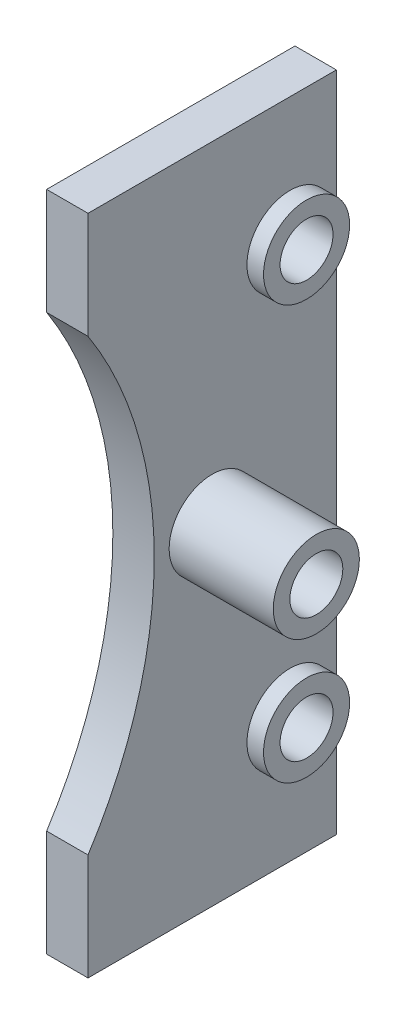
ISO-10303-21;
HEADER;
FILE_DESCRIPTION(('STEP AP214'),'2;1');
FILE_NAME('part.step','',(''),(''),'','','');
FILE_SCHEMA(('AUTOMOTIVE_DESIGN { 1 0 10303 214 1 1 1 1 }'));
ENDSEC;
DATA;
#1=APPLICATION_CONTEXT('core data for automotive mechanical design processes');
#2=APPLICATION_PROTOCOL_DEFINITION('international standard','automotive_design',2000,#1);
#3=PRODUCT_CONTEXT('',#1,'mechanical');
#4=PRODUCT('Part','Part','',(#3));
#5=PRODUCT_RELATED_PRODUCT_CATEGORY('part','',(#4));
#6=PRODUCT_DEFINITION_FORMATION('','',#4);
#7=PRODUCT_DEFINITION_CONTEXT('part definition',#1,'design');
#8=PRODUCT_DEFINITION('design','',#6,#7);
#9=PRODUCT_DEFINITION_SHAPE('','',#8);
#10=(LENGTH_UNIT() NAMED_UNIT(*) SI_UNIT(.MILLI.,.METRE.));
#11=(NAMED_UNIT(*) PLANE_ANGLE_UNIT() SI_UNIT($,.RADIAN.));
#12=(NAMED_UNIT(*) SI_UNIT($,.STERADIAN.) SOLID_ANGLE_UNIT());
#13=UNCERTAINTY_MEASURE_WITH_UNIT(LENGTH_MEASURE(1.E-05),#10,'distance_accuracy_value','');
#14=(GEOMETRIC_REPRESENTATION_CONTEXT(3) GLOBAL_UNCERTAINTY_ASSIGNED_CONTEXT((#13)) GLOBAL_UNIT_ASSIGNED_CONTEXT((#10,
#11,#12)) REPRESENTATION_CONTEXT('',''));
#15=CARTESIAN_POINT('',(0.,0.,0.));
#16=DIRECTION('',(0.,0.,1.));
#17=DIRECTION('',(1.,0.,0.));
#18=AXIS2_PLACEMENT_3D('',#15,#16,#17);
#19=CARTESIAN_POINT('',(-7.5,0.,0.));
#20=DIRECTION('',(0.,0.,1.));
#21=DIRECTION('',(-1.,0.,0.));
#22=AXIS2_PLACEMENT_3D('',#19,#20,#21);
#23=PLANE('',#22);
#24=DIRECTION('',(-1.,0.,0.));
#25=VECTOR('',#24,1.);
#26=CARTESIAN_POINT('',(-2.5,33.5646599662505,0.));
#27=LINE('',#26,#25);
#28=CARTESIAN_POINT('',(-2.5,33.5646599662505,0.));
#29=VERTEX_POINT('',#28);
#30=CARTESIAN_POINT('',(-5.,33.5646599662505,0.));
#31=VERTEX_POINT('',#30);
#32=EDGE_CURVE('E84',#29,#31,#27,.T.);
#33=ORIENTED_EDGE('',*,*,#32,.F.);
#34=DIRECTION('',(0.,1.,0.));
#35=VECTOR('',#34,1.);
#36=CARTESIAN_POINT('',(-2.5,0.,0.));
#37=LINE('',#36,#35);
#38=CARTESIAN_POINT('',(-2.5,40.,0.));
#39=VERTEX_POINT('',#38);
#40=EDGE_CURVE('E134',#29,#39,#37,.T.);
#41=ORIENTED_EDGE('',*,*,#40,.T.);
#42=DIRECTION('',(1.,0.,0.));
#43=VECTOR('',#42,1.);
#44=CARTESIAN_POINT('',(-7.5,40.,0.));
#45=LINE('',#44,#43);
#46=CARTESIAN_POINT('',(-5.,40.,0.));
#47=VERTEX_POINT('',#46);
#48=EDGE_CURVE('E160',#47,#39,#45,.T.);
#49=ORIENTED_EDGE('',*,*,#48,.F.);
#50=DIRECTION('',(0.,1.,0.));
#51=VECTOR('',#50,1.);
#52=CARTESIAN_POINT('',(-5.,0.,0.));
#53=LINE('',#52,#51);
#54=EDGE_CURVE('E136',#31,#47,#53,.T.);
#55=ORIENTED_EDGE('',*,*,#54,.F.);
#56=EDGE_LOOP('',(#33,#41,#49,#55));
#57=FACE_BOUND('',#56,.T.);
#58=ADVANCED_FACE('F68',(#57),#23,.T.);
#59=CARTESIAN_POINT('',(-7.5,0.,0.));
#60=DIRECTION('',(0.,1.,0.));
#61=DIRECTION('',(0.,0.,1.));
#62=AXIS2_PLACEMENT_3D('',#59,#60,#61);
#63=PLANE('',#62);
#64=DIRECTION('',(0.,0.,1.));
#65=VECTOR('',#64,1.);
#66=CARTESIAN_POINT('',(-5.,0.,0.));
#67=LINE('',#66,#65);
#68=CARTESIAN_POINT('',(-5.,0.,-15.));
#69=VERTEX_POINT('',#68);
#70=CARTESIAN_POINT('',(-5.,0.,0.));
#71=VERTEX_POINT('',#70);
#72=EDGE_CURVE('E92',#69,#71,#67,.T.);
#73=ORIENTED_EDGE('',*,*,#72,.F.);
#74=DIRECTION('',(1.,0.,0.));
#75=VECTOR('',#74,1.);
#76=CARTESIAN_POINT('',(-7.5,0.,-15.));
#77=LINE('',#76,#75);
#78=CARTESIAN_POINT('',(-2.5,0.,-15.));
#79=VERTEX_POINT('',#78);
#80=EDGE_CURVE('E164',#69,#79,#77,.T.);
#81=ORIENTED_EDGE('',*,*,#80,.T.);
#82=DIRECTION('',(0.,0.,-1.));
#83=VECTOR('',#82,1.);
#84=CARTESIAN_POINT('',(-2.5,0.,0.));
#85=LINE('',#84,#83);
#86=CARTESIAN_POINT('',(-2.5,0.,0.));
#87=VERTEX_POINT('',#86);
#88=EDGE_CURVE('E147',#87,#79,#85,.T.);
#89=ORIENTED_EDGE('',*,*,#88,.F.);
#90=DIRECTION('',(1.,0.,0.));
#91=VECTOR('',#90,1.);
#92=CARTESIAN_POINT('',(-7.5,0.,0.));
#93=LINE('',#92,#91);
#94=EDGE_CURVE('E158',#71,#87,#93,.T.);
#95=ORIENTED_EDGE('',*,*,#94,.F.);
#96=EDGE_LOOP('',(#73,#81,#89,#95));
#97=FACE_BOUND('',#96,.T.);
#98=ADVANCED_FACE('F70',(#97),#63,.F.);
#99=CARTESIAN_POINT('',(-7.5,0.,-15.));
#100=DIRECTION('',(0.,0.,1.));
#101=DIRECTION('',(-1.,0.,0.));
#102=AXIS2_PLACEMENT_3D('',#99,#100,#101);
#103=PLANE('',#102);
#104=DIRECTION('',(0.,-1.,0.));
#105=VECTOR('',#104,1.);
#106=CARTESIAN_POINT('',(-5.,0.,-15.));
#107=LINE('',#106,#105);
#108=CARTESIAN_POINT('',(-5.,40.,-15.));
#109=VERTEX_POINT('',#108);
#110=EDGE_CURVE('E221',#109,#69,#107,.T.);
#111=ORIENTED_EDGE('',*,*,#110,.F.);
#112=DIRECTION('',(1.,0.,0.));
#113=VECTOR('',#112,1.);
#114=CARTESIAN_POINT('',(-7.5,40.,-15.));
#115=LINE('',#114,#113);
#116=CARTESIAN_POINT('',(-2.5,40.,-15.));
#117=VERTEX_POINT('',#116);
#118=EDGE_CURVE('E162',#109,#117,#115,.T.);
#119=ORIENTED_EDGE('',*,*,#118,.T.);
#120=DIRECTION('',(0.,1.,0.));
#121=VECTOR('',#120,1.);
#122=CARTESIAN_POINT('',(-2.5,0.,-15.));
#123=LINE('',#122,#121);
#124=EDGE_CURVE('E155',#79,#117,#123,.T.);
#125=ORIENTED_EDGE('',*,*,#124,.F.);
#126=ORIENTED_EDGE('',*,*,#80,.F.);
#127=EDGE_LOOP('',(#111,#119,#125,#126));
#128=FACE_BOUND('',#127,.T.);
#129=ADVANCED_FACE('F199',(#128),#103,.F.);
#130=CARTESIAN_POINT('',(-7.5,40.,0.));
#131=DIRECTION('',(0.,1.,0.));
#132=DIRECTION('',(0.,0.,1.));
#133=AXIS2_PLACEMENT_3D('',#130,#131,#132);
#134=PLANE('',#133);
#135=ORIENTED_EDGE('',*,*,#118,.F.);
#136=DIRECTION('',(0.,0.,-1.));
#137=VECTOR('',#136,1.);
#138=CARTESIAN_POINT('',(-5.,40.,0.));
#139=LINE('',#138,#137);
#140=EDGE_CURVE('E219',#47,#109,#139,.T.);
#141=ORIENTED_EDGE('',*,*,#140,.F.);
#142=ORIENTED_EDGE('',*,*,#48,.T.);
#143=DIRECTION('',(0.,0.,-1.));
#144=VECTOR('',#143,1.);
#145=CARTESIAN_POINT('',(-2.5,40.,0.));
#146=LINE('',#145,#144);
#147=EDGE_CURVE('E143',#39,#117,#146,.T.);
#148=ORIENTED_EDGE('',*,*,#147,.T.);
#149=EDGE_LOOP('',(#135,#141,#142,#148));
#150=FACE_BOUND('',#149,.T.);
#151=ADVANCED_FACE('F275',(#150),#134,.T.);
#152=CARTESIAN_POINT('',(-7.5,32.5,-12.2));
#153=DIRECTION('',(1.,0.,0.));
#154=DIRECTION('',(0.,0.,1.));
#155=AXIS2_PLACEMENT_3D('',#152,#153,#154);
#156=CYLINDRICAL_SURFACE('',#155,1.6);
#157=CARTESIAN_POINT('',(-1.5,32.5,-12.2));
#158=DIRECTION('',(-1.,0.,0.));
#159=DIRECTION('',(0.,0.,1.));
#160=AXIS2_PLACEMENT_3D('',#157,#158,#159);
#161=CIRCLE('',#160,1.6);
#162=CARTESIAN_POINT('',(-1.5,32.5,-10.6));
#163=VERTEX_POINT('',#162);
#164=EDGE_CURVE('E238',#163,#163,#161,.T.);
#165=ORIENTED_EDGE('',*,*,#164,.F.);
#166=EDGE_LOOP('',(#165));
#167=FACE_BOUND('',#166,.T.);
#168=CARTESIAN_POINT('',(-5.,32.5,-12.2));
#169=DIRECTION('',(-1.,0.,0.));
#170=DIRECTION('',(0.,0.,1.));
#171=AXIS2_PLACEMENT_3D('',#168,#169,#170);
#172=CIRCLE('',#171,1.6);
#173=CARTESIAN_POINT('',(-5.,32.5,-10.6));
#174=VERTEX_POINT('',#173);
#175=EDGE_CURVE('E229',#174,#174,#172,.T.);
#176=ORIENTED_EDGE('',*,*,#175,.T.);
#177=EDGE_LOOP('',(#176));
#178=FACE_BOUND('',#177,.T.);
#179=ADVANCED_FACE('F212',(#167,#178),#156,.F.);
#180=CARTESIAN_POINT('',(-7.5,20.,-7.5));
#181=DIRECTION('',(1.,0.,0.));
#182=DIRECTION('',(0.,0.,1.));
#183=AXIS2_PLACEMENT_3D('',#180,#181,#182);
#184=CYLINDRICAL_SURFACE('',#183,1.6);
#185=CARTESIAN_POINT('',(3.79,20.,-7.5));
#186=DIRECTION('',(1.,0.,0.));
#187=DIRECTION('',(0.,0.,-1.));
#188=AXIS2_PLACEMENT_3D('',#185,#186,#187);
#189=CIRCLE('',#188,1.6);
#190=CARTESIAN_POINT('',(3.79,20.,-9.1));
#191=VERTEX_POINT('',#190);
#192=EDGE_CURVE('E232',#191,#191,#189,.T.);
#193=ORIENTED_EDGE('',*,*,#192,.T.);
#194=EDGE_LOOP('',(#193));
#195=FACE_BOUND('',#194,.T.);
#196=CARTESIAN_POINT('',(-5.,20.,-7.5));
#197=DIRECTION('',(-1.,0.,0.));
#198=DIRECTION('',(0.,0.,1.));
#199=AXIS2_PLACEMENT_3D('',#196,#197,#198);
#200=CIRCLE('',#199,1.6);
#201=CARTESIAN_POINT('',(-5.,20.,-5.9));
#202=VERTEX_POINT('',#201);
#203=EDGE_CURVE('E226',#202,#202,#200,.T.);
#204=ORIENTED_EDGE('',*,*,#203,.T.);
#205=EDGE_LOOP('',(#204));
#206=FACE_BOUND('',#205,.T.);
#207=ADVANCED_FACE('F204',(#195,#206),#184,.F.);
#208=DIRECTION('',(-1.,0.,0.));
#209=VECTOR('',#208,1.);
#210=CARTESIAN_POINT('',(-2.5,6.43534003374946,0.));
#211=LINE('',#210,#209);
#212=CARTESIAN_POINT('',(-2.5,6.43534003374946,0.));
#213=VERTEX_POINT('',#212);
#214=CARTESIAN_POINT('',(-5.,6.43534003374946,0.));
#215=VERTEX_POINT('',#214);
#216=EDGE_CURVE('E124',#213,#215,#211,.T.);
#217=ORIENTED_EDGE('',*,*,#216,.T.);
#218=EDGE_CURVE('E214',#71,#215,#53,.T.);
#219=ORIENTED_EDGE('',*,*,#218,.F.);
#220=ORIENTED_EDGE('',*,*,#94,.T.);
#221=EDGE_CURVE('E144',#87,#213,#37,.T.);
#222=ORIENTED_EDGE('',*,*,#221,.T.);
#223=EDGE_LOOP('',(#217,#219,#220,#222));
#224=FACE_BOUND('',#223,.T.);
#225=ADVANCED_FACE('F193',(#224),#23,.T.);
#226=CARTESIAN_POINT('',(-7.5,7.5,-12.2));
#227=DIRECTION('',(1.,0.,0.));
#228=DIRECTION('',(0.,0.,1.));
#229=AXIS2_PLACEMENT_3D('',#226,#227,#228);
#230=CYLINDRICAL_SURFACE('',#229,1.6);
#231=CARTESIAN_POINT('',(-1.5,7.5,-12.2));
#232=DIRECTION('',(-1.,0.,0.));
#233=DIRECTION('',(0.,0.,1.));
#234=AXIS2_PLACEMENT_3D('',#231,#232,#233);
#235=CIRCLE('',#234,1.6);
#236=CARTESIAN_POINT('',(-1.5,7.5,-10.6));
#237=VERTEX_POINT('',#236);
#238=EDGE_CURVE('E149',#237,#237,#235,.T.);
#239=ORIENTED_EDGE('',*,*,#238,.F.);
#240=EDGE_LOOP('',(#239));
#241=FACE_BOUND('',#240,.T.);
#242=CARTESIAN_POINT('',(-5.,7.5,-12.2));
#243=DIRECTION('',(-1.,0.,0.));
#244=DIRECTION('',(0.,0.,1.));
#245=AXIS2_PLACEMENT_3D('',#242,#243,#244);
#246=CIRCLE('',#245,1.6);
#247=CARTESIAN_POINT('',(-5.,7.5,-10.6));
#248=VERTEX_POINT('',#247);
#249=EDGE_CURVE('E72',#248,#248,#246,.T.);
#250=ORIENTED_EDGE('',*,*,#249,.T.);
#251=EDGE_LOOP('',(#250));
#252=FACE_BOUND('',#251,.T.);
#253=ADVANCED_FACE('F203',(#241,#252),#230,.F.);
#254=CARTESIAN_POINT('',(-2.5,0.,0.));
#255=DIRECTION('',(-1.,0.,0.));
#256=DIRECTION('',(0.,0.,-1.));
#257=AXIS2_PLACEMENT_3D('',#254,#255,#256);
#258=PLANE('',#257);
#259=CARTESIAN_POINT('',(-2.5,32.5,-12.2));
#260=DIRECTION('',(1.,0.,0.));
#261=DIRECTION('',(0.,0.,-1.));
#262=AXIS2_PLACEMENT_3D('',#259,#260,#261);
#263=CIRCLE('',#262,2.6);
#264=CARTESIAN_POINT('',(-2.5,32.5,-14.8));
#265=VERTEX_POINT('',#264);
#266=EDGE_CURVE('E77',#265,#265,#263,.F.);
#267=ORIENTED_EDGE('',*,*,#266,.T.);
#268=EDGE_LOOP('',(#267));
#269=FACE_BOUND('',#268,.T.);
#270=ORIENTED_EDGE('',*,*,#40,.F.);
#271=CARTESIAN_POINT('',(-2.5,20.,21.));
#272=DIRECTION('',(-1.,0.,0.));
#273=DIRECTION('',(0.,0.,1.));
#274=AXIS2_PLACEMENT_3D('',#271,#272,#273);
#275=CIRCLE('',#274,25.);
#276=EDGE_CURVE('E121',#29,#213,#275,.T.);
#277=ORIENTED_EDGE('',*,*,#276,.T.);
#278=ORIENTED_EDGE('',*,*,#221,.F.);
#279=ORIENTED_EDGE('',*,*,#88,.T.);
#280=ORIENTED_EDGE('',*,*,#124,.T.);
#281=ORIENTED_EDGE('',*,*,#147,.F.);
#282=EDGE_LOOP('',(#270,#277,#278,#279,#280,#281));
#283=FACE_BOUND('',#282,.T.);
#284=CARTESIAN_POINT('',(-2.5,7.5,-12.2));
#285=DIRECTION('',(1.,0.,0.));
#286=DIRECTION('',(0.,0.,-1.));
#287=AXIS2_PLACEMENT_3D('',#284,#285,#286);
#288=CIRCLE('',#287,2.6);
#289=CARTESIAN_POINT('',(-2.5,7.5,-14.8));
#290=VERTEX_POINT('',#289);
#291=EDGE_CURVE('E166',#290,#290,#288,.F.);
#292=ORIENTED_EDGE('',*,*,#291,.T.);
#293=EDGE_LOOP('',(#292));
#294=FACE_BOUND('',#293,.T.);
#295=CARTESIAN_POINT('',(-2.5,20.,-7.5));
#296=DIRECTION('',(-1.,0.,0.));
#297=DIRECTION('',(0.,0.,1.));
#298=AXIS2_PLACEMENT_3D('',#295,#296,#297);
#299=CIRCLE('',#298,2.6);
#300=CARTESIAN_POINT('',(-2.5,20.,-4.9));
#301=VERTEX_POINT('',#300);
#302=EDGE_CURVE('E12',#301,#301,#299,.F.);
#303=ORIENTED_EDGE('',*,*,#302,.F.);
#304=EDGE_LOOP('',(#303));
#305=FACE_BOUND('',#304,.T.);
#306=ADVANCED_FACE('F139',(#269,#283,#294,#305),#258,.F.);
#307=CARTESIAN_POINT('',(-1.5,7.5,-12.2));
#308=DIRECTION('',(1.,0.,0.));
#309=DIRECTION('',(0.,0.,1.));
#310=AXIS2_PLACEMENT_3D('',#307,#308,#309);
#311=PLANE('',#310);
#312=CARTESIAN_POINT('',(-1.5,7.5,-12.2));
#313=DIRECTION('',(-1.,0.,0.));
#314=DIRECTION('',(0.,0.,1.));
#315=AXIS2_PLACEMENT_3D('',#312,#313,#314);
#316=CIRCLE('',#315,2.6);
#317=CARTESIAN_POINT('',(-1.5,7.5,-9.6));
#318=VERTEX_POINT('',#317);
#319=EDGE_CURVE('E145',#318,#318,#316,.T.);
#320=ORIENTED_EDGE('',*,*,#319,.F.);
#321=EDGE_LOOP('',(#320));
#322=FACE_BOUND('',#321,.T.);
#323=ORIENTED_EDGE('',*,*,#238,.T.);
#324=EDGE_LOOP('',(#323));
#325=FACE_BOUND('',#324,.T.);
#326=ADVANCED_FACE('F245',(#322,#325),#311,.T.);
#327=CARTESIAN_POINT('',(-1.5,7.5,-12.2));
#328=DIRECTION('',(-1.,0.,0.));
#329=DIRECTION('',(0.,0.,-1.));
#330=AXIS2_PLACEMENT_3D('',#327,#328,#329);
#331=CYLINDRICAL_SURFACE('',#330,2.6);
#332=ORIENTED_EDGE('',*,*,#319,.T.);
#333=EDGE_LOOP('',(#332));
#334=FACE_BOUND('',#333,.T.);
#335=ORIENTED_EDGE('',*,*,#291,.F.);
#336=EDGE_LOOP('',(#335));
#337=FACE_BOUND('',#336,.T.);
#338=ADVANCED_FACE('F186',(#334,#337),#331,.T.);
#339=CARTESIAN_POINT('',(-1.5,32.5,-12.2));
#340=DIRECTION('',(1.,0.,0.));
#341=DIRECTION('',(0.,0.,1.));
#342=AXIS2_PLACEMENT_3D('',#339,#340,#341);
#343=PLANE('',#342);
#344=CARTESIAN_POINT('',(-1.5,32.5,-12.2));
#345=DIRECTION('',(-1.,0.,0.));
#346=DIRECTION('',(0.,0.,1.));
#347=AXIS2_PLACEMENT_3D('',#344,#345,#346);
#348=CIRCLE('',#347,2.6);
#349=CARTESIAN_POINT('',(-1.5,32.5,-9.60000000000001));
#350=VERTEX_POINT('',#349);
#351=EDGE_CURVE('E241',#350,#350,#348,.T.);
#352=ORIENTED_EDGE('',*,*,#351,.F.);
#353=EDGE_LOOP('',(#352));
#354=FACE_BOUND('',#353,.T.);
#355=ORIENTED_EDGE('',*,*,#164,.T.);
#356=EDGE_LOOP('',(#355));
#357=FACE_BOUND('',#356,.T.);
#358=ADVANCED_FACE('F176',(#354,#357),#343,.T.);
#359=CARTESIAN_POINT('',(-1.5,32.5,-12.2));
#360=DIRECTION('',(-1.,0.,0.));
#361=DIRECTION('',(0.,0.,-1.));
#362=AXIS2_PLACEMENT_3D('',#359,#360,#361);
#363=CYLINDRICAL_SURFACE('',#362,2.6);
#364=ORIENTED_EDGE('',*,*,#351,.T.);
#365=EDGE_LOOP('',(#364));
#366=FACE_BOUND('',#365,.T.);
#367=ORIENTED_EDGE('',*,*,#266,.F.);
#368=EDGE_LOOP('',(#367));
#369=FACE_BOUND('',#368,.T.);
#370=ADVANCED_FACE('F173',(#366,#369),#363,.T.);
#371=CARTESIAN_POINT('',(3.79,20.,-7.5));
#372=DIRECTION('',(1.,0.,0.));
#373=DIRECTION('',(0.,0.,-1.));
#374=AXIS2_PLACEMENT_3D('',#371,#372,#373);
#375=PLANE('',#374);
#376=CARTESIAN_POINT('',(3.79,20.,-7.5));
#377=DIRECTION('',(1.,0.,0.));
#378=DIRECTION('',(0.,0.,-1.));
#379=AXIS2_PLACEMENT_3D('',#376,#377,#378);
#380=CIRCLE('',#379,2.6);
#381=CARTESIAN_POINT('',(3.79,20.,-10.1));
#382=VERTEX_POINT('',#381);
#383=EDGE_CURVE('E235',#382,#382,#380,.T.);
#384=ORIENTED_EDGE('',*,*,#383,.T.);
#385=EDGE_LOOP('',(#384));
#386=FACE_BOUND('',#385,.T.);
#387=ORIENTED_EDGE('',*,*,#192,.F.);
#388=EDGE_LOOP('',(#387));
#389=FACE_BOUND('',#388,.T.);
#390=ADVANCED_FACE('F175',(#386,#389),#375,.T.);
#391=CARTESIAN_POINT('',(3.79,20.,-7.5));
#392=DIRECTION('',(-1.,0.,0.));
#393=DIRECTION('',(0.,0.,1.));
#394=AXIS2_PLACEMENT_3D('',#391,#392,#393);
#395=CYLINDRICAL_SURFACE('',#394,2.6);
#396=ORIENTED_EDGE('',*,*,#383,.F.);
#397=EDGE_LOOP('',(#396));
#398=FACE_BOUND('',#397,.T.);
#399=ORIENTED_EDGE('',*,*,#302,.T.);
#400=EDGE_LOOP('',(#399));
#401=FACE_BOUND('',#400,.T.);
#402=ADVANCED_FACE('F183',(#398,#401),#395,.T.);
#403=CARTESIAN_POINT('',(-5.,0.,0.));
#404=DIRECTION('',(-1.,0.,0.));
#405=DIRECTION('',(0.,0.,1.));
#406=AXIS2_PLACEMENT_3D('',#403,#404,#405);
#407=PLANE('',#406);
#408=CARTESIAN_POINT('',(-5.,20.,21.));
#409=DIRECTION('',(-1.,0.,0.));
#410=DIRECTION('',(0.,0.,1.));
#411=AXIS2_PLACEMENT_3D('',#408,#409,#410);
#412=CIRCLE('',#411,25.);
#413=EDGE_CURVE('E129',#31,#215,#412,.T.);
#414=ORIENTED_EDGE('',*,*,#413,.F.);
#415=ORIENTED_EDGE('',*,*,#54,.T.);
#416=ORIENTED_EDGE('',*,*,#140,.T.);
#417=ORIENTED_EDGE('',*,*,#110,.T.);
#418=ORIENTED_EDGE('',*,*,#72,.T.);
#419=ORIENTED_EDGE('',*,*,#218,.T.);
#420=EDGE_LOOP('',(#414,#415,#416,#417,#418,#419));
#421=FACE_BOUND('',#420,.T.);
#422=ORIENTED_EDGE('',*,*,#175,.F.);
#423=EDGE_LOOP('',(#422));
#424=FACE_BOUND('',#423,.T.);
#425=ORIENTED_EDGE('',*,*,#203,.F.);
#426=EDGE_LOOP('',(#425));
#427=FACE_BOUND('',#426,.T.);
#428=ORIENTED_EDGE('',*,*,#249,.F.);
#429=EDGE_LOOP('',(#428));
#430=FACE_BOUND('',#429,.T.);
#431=ADVANCED_FACE('F217',(#421,#424,#427,#430),#407,.T.);
#432=CARTESIAN_POINT('',(-2.5,20.,21.));
#433=DIRECTION('',(-1.,0.,0.));
#434=DIRECTION('',(0.,0.,1.));
#435=AXIS2_PLACEMENT_3D('',#432,#433,#434);
#436=CYLINDRICAL_SURFACE('',#435,25.);
#437=ORIENTED_EDGE('',*,*,#413,.T.);
#438=ORIENTED_EDGE('',*,*,#216,.F.);
#439=ORIENTED_EDGE('',*,*,#276,.F.);
#440=ORIENTED_EDGE('',*,*,#32,.T.);
#441=EDGE_LOOP('',(#437,#438,#439,#440));
#442=FACE_BOUND('',#441,.T.);
#443=ADVANCED_FACE('F122',(#442),#436,.F.);
#444=CLOSED_SHELL('',(#58,#98,#129,#151,#179,#207,#225,#253,#306,#326,#338,#358,#370,#390,#402,
#431,#443));
#445=MANIFOLD_SOLID_BREP('B2',#444);
#446=ADVANCED_BREP_SHAPE_REPRESENTATION('',(#18,#445),#14);
#447=SHAPE_DEFINITION_REPRESENTATION(#9,#446);
ENDSEC;
END-ISO-10303-21;
